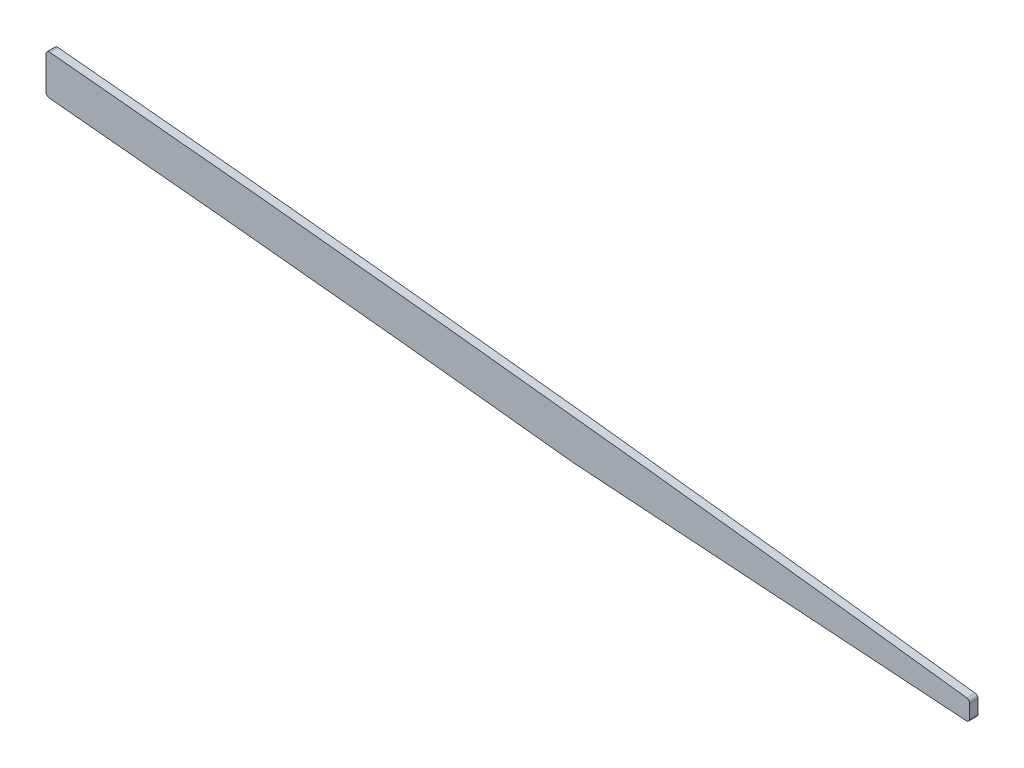
ISO-10303-21;
HEADER;
FILE_DESCRIPTION(('STEP AP214'),'2;1');
FILE_NAME('part.step','',(''),(''),'','','');
FILE_SCHEMA(('AUTOMOTIVE_DESIGN { 1 0 10303 214 1 1 1 1 }'));
ENDSEC;
DATA;
#1=APPLICATION_CONTEXT('core data for automotive mechanical design processes');
#2=APPLICATION_PROTOCOL_DEFINITION('international standard','automotive_design',2000,#1);
#3=PRODUCT_CONTEXT('',#1,'mechanical');
#4=PRODUCT('Part','Part','',(#3));
#5=PRODUCT_RELATED_PRODUCT_CATEGORY('part','',(#4));
#6=PRODUCT_DEFINITION_FORMATION('','',#4);
#7=PRODUCT_DEFINITION_CONTEXT('part definition',#1,'design');
#8=PRODUCT_DEFINITION('design','',#6,#7);
#9=PRODUCT_DEFINITION_SHAPE('','',#8);
#10=(LENGTH_UNIT() NAMED_UNIT(*) SI_UNIT(.MILLI.,.METRE.));
#11=(NAMED_UNIT(*) PLANE_ANGLE_UNIT() SI_UNIT($,.RADIAN.));
#12=(NAMED_UNIT(*) SI_UNIT($,.STERADIAN.) SOLID_ANGLE_UNIT());
#13=UNCERTAINTY_MEASURE_WITH_UNIT(LENGTH_MEASURE(1.E-05),#10,'distance_accuracy_value','');
#14=(GEOMETRIC_REPRESENTATION_CONTEXT(3) GLOBAL_UNCERTAINTY_ASSIGNED_CONTEXT((#13)) GLOBAL_UNIT_ASSIGNED_CONTEXT((#10,
#11,#12)) REPRESENTATION_CONTEXT('',''));
#15=CARTESIAN_POINT('',(0.,0.,0.));
#16=DIRECTION('',(0.,0.,1.));
#17=DIRECTION('',(1.,0.,0.));
#18=AXIS2_PLACEMENT_3D('',#15,#16,#17);
#19=CARTESIAN_POINT('',(2311.4,-7.40544774906732E-11,1.5875));
#20=DIRECTION('',(1.,0.,0.));
#21=DIRECTION('',(0.,1.,0.));
#22=AXIS2_PLACEMENT_3D('',#19,#20,#21);
#23=PLANE('',#22);
#24=DIRECTION('',(0.,-1.,0.));
#25=VECTOR('',#24,1.);
#26=CARTESIAN_POINT('',(2311.4,-7.40544774906732E-11,-1.5875));
#27=LINE('',#26,#25);
#28=CARTESIAN_POINT('',(2311.4,134.435488249285,-1.5875));
#29=VERTEX_POINT('',#28);
#30=CARTESIAN_POINT('',(2311.4,121.679854212148,-1.5875));
#31=VERTEX_POINT('',#30);
#32=EDGE_CURVE('E177',#29,#31,#27,.T.);
#33=ORIENTED_EDGE('',*,*,#32,.T.);
#34=DIRECTION('',(0.,0.,-1.));
#35=VECTOR('',#34,1.);
#36=CARTESIAN_POINT('',(2311.4,121.679854212148,1.5875));
#37=LINE('',#36,#35);
#38=CARTESIAN_POINT('',(2311.4,121.679854212148,1.5875));
#39=VERTEX_POINT('',#38);
#40=EDGE_CURVE('E224',#31,#39,#37,.F.);
#41=ORIENTED_EDGE('',*,*,#40,.T.);
#42=DIRECTION('',(0.,-1.,0.));
#43=VECTOR('',#42,1.);
#44=CARTESIAN_POINT('',(2311.4,-7.40544774906732E-11,1.5875));
#45=LINE('',#44,#43);
#46=CARTESIAN_POINT('',(2311.4,134.435488249285,1.5875));
#47=VERTEX_POINT('',#46);
#48=EDGE_CURVE('E129',#47,#39,#45,.T.);
#49=ORIENTED_EDGE('',*,*,#48,.F.);
#50=DIRECTION('',(0.,0.,1.));
#51=VECTOR('',#50,1.);
#52=CARTESIAN_POINT('',(2311.4,134.435488249285,-1.5875));
#53=LINE('',#52,#51);
#54=EDGE_CURVE('E214',#47,#29,#53,.F.);
#55=ORIENTED_EDGE('',*,*,#54,.T.);
#56=EDGE_LOOP('',(#33,#41,#49,#55));
#57=FACE_BOUND('',#56,.T.);
#58=ADVANCED_FACE('F38',(#57),#23,.F.);
#59=CARTESIAN_POINT('',(816.035490090419,249.602504502473,1.5875));
#60=CARTESIAN_POINT('',(820.895958915978,248.948752998504,1.5875));
#61=CARTESIAN_POINT('',(830.611237516535,247.699685180795,1.5875));
#62=CARTESIAN_POINT('',(845.281067269815,245.953419482549,1.5875));
#63=CARTESIAN_POINT('',(860.086531547022,244.295598067093,1.5875));
#64=CARTESIAN_POINT('',(879.83070343434,242.186646027517,1.5875));
#65=CARTESIAN_POINT('',(904.36996709185,239.698279805688,1.5875));
#66=CARTESIAN_POINT('',(933.571022669327,236.832150625483,1.5875));
#67=CARTESIAN_POINT('',(962.642718040815,234.023667740898,1.5875));
#68=CARTESIAN_POINT('',(991.762593942944,231.241975908087,1.5875));
#69=CARTESIAN_POINT('',(1021.07201031471,228.475862291185,1.5875));
#70=CARTESIAN_POINT('',(1060.37643731472,224.796956681051,1.5875));
#71=CARTESIAN_POINT('',(1109.51301557685,220.18437886172,1.5875));
#72=CARTESIAN_POINT('',(1168.51119036116,214.817071985159,1.5875));
#73=CARTESIAN_POINT('',(1227.50012979269,209.662054041939,1.5875));
#74=CARTESIAN_POINT('',(1306.13316794657,203.021178328389,1.5875));
#75=CARTESIAN_POINT('',(1404.36147710547,194.920725932278,1.5875));
#76=CARTESIAN_POINT('',(1522.23985107062,184.918066624094,1.5875));
#77=CARTESIAN_POINT('',(1640.18285649102,175.16700778633,1.5875));
#78=CARTESIAN_POINT('',(1758.16535256682,165.7576394845,1.5875));
#79=CARTESIAN_POINT('',(1876.15538476943,156.590937078959,1.5875));
#80=CARTESIAN_POINT('',(1994.08749188002,147.453250142139,1.5875));
#81=CARTESIAN_POINT('',(2092.26869206097,139.624216053351,1.5875));
#82=CARTESIAN_POINT('',(2170.74802904205,133.07965672904,1.5875));
#83=CARTESIAN_POINT('',(2219.77173097685,128.842227835716,1.5875));
#84=CARTESIAN_POINT('',(2258.98398824696,125.347211495477,1.5875));
#85=CARTESIAN_POINT('',(2288.37945753647,122.670854497073,1.5875));
#86=CARTESIAN_POINT('',(2317.81224311603,119.931729386451,1.5875));
#87=CARTESIAN_POINT('',(2347.55150917161,117.100365282643,1.5875));
#88=CARTESIAN_POINT('',(2377.15989972739,114.210118529692,1.5875));
#89=CARTESIAN_POINT('',(2406.46965385077,111.268968010355,1.5875));
#90=CARTESIAN_POINT('',(2435.81832605954,108.240091266207,1.5875));
#91=CARTESIAN_POINT('',(2469.02470752222,104.715289084564,1.5875));
#92=CARTESIAN_POINT('',(2497.31327256554,101.612328458115,1.5875));
#93=CARTESIAN_POINT('',(2518.24528997175,99.2591125176473,1.5875));
#94=CARTESIAN_POINT('',(2543.59485523623,96.3823723988054,1.5875));
#95=CARTESIAN_POINT('',(2583.46809293913,91.7389200548886,1.5875));
#96=CARTESIAN_POINT('',(2626.50474404992,86.507235465956,1.5875));
#97=CARTESIAN_POINT('',(2656.9573225255,82.7046844863666,1.5875));
#98=CARTESIAN_POINT('',(2676.22814845177,80.2695409508187,1.5875));
#99=CARTESIAN_POINT('',(2689.72957405404,78.5388507758172,1.5875));
#100=CARTESIAN_POINT('',(2697.83785996013,77.4903351724698,1.5875));
#101=B_SPLINE_CURVE_WITH_KNOTS('',3,(#59,#60,#61,#62,#63,#64,#65,#66,#67,#68,#69,#70,#71,#72,
#73,#74,#75,#76,#77,#78,#79,#80,#81,#82,#83,#84,#85,#86,#87,#88,#89,#90,#91,#92,#93,#94,#95,#96,
#97,#98,#99,#100),.UNSPECIFIED.,.F.,.F.,(4,1,1,1,1,1,1,1,1,1,1,1,1,1,1,1,1,1,1,1,1,1,1,1,1,1,1,
1,1,1,1,1,1,1,1,1,1,1,1,4),(77.9308215150932,79.3861761032565,80.8415306914199,82.2968852795832,
83.7522398677466,86.6629490440732,89.5736582203999,92.4843673967266,95.3950765730532,
98.3057857493799,101.216494925707,107.03791327836,112.859331631013,118.680749983667,
124.50216833632,136.145005041627,147.787841746933,159.43067845224,171.073515157547,
182.716351862853,194.35918856816,206.002025273467,211.82344362612,217.644861978773,
220.5555711551,223.466280331427,226.376989507753,229.28769868408,232.198407860407,
235.109117036733,238.01982621306,240.930535389387,244.99811874271,246.453473330873,
247.181150624955,252.573372094693,258.394790447347,260.132380463724,261.765911798234,
264.2162088),.UNSPECIFIED.);
#102=DIRECTION('',(0.,0.,-1.));
#103=VECTOR('',#102,1.);
#104=SURFACE_OF_LINEAR_EXTRUSION('',#101,#103);
#105=CARTESIAN_POINT('',(2312.55144834193,120.415399584901,1.5875));
#106=VERTEX_POINT('',#105);
#107=CARTESIAN_POINT('',(2513.37105245866,99.8062133455946,1.5875));
#108=VERTEX_POINT('',#107);
#109=EDGE_CURVE('E119',#106,#108,#101,.T.);
#110=ORIENTED_EDGE('',*,*,#109,.F.);
#111=DIRECTION('',(0.,0.,-1.));
#112=VECTOR('',#111,1.);
#113=CARTESIAN_POINT('',(2312.55144834193,120.415399584901,1.5875));
#114=LINE('',#113,#112);
#115=CARTESIAN_POINT('',(2312.55144834193,120.415399584901,-1.5875));
#116=VERTEX_POINT('',#115);
#117=EDGE_CURVE('E135',#106,#116,#114,.T.);
#118=ORIENTED_EDGE('',*,*,#117,.T.);
#119=CARTESIAN_POINT('',(816.035490090419,249.602504502473,-1.5875));
#120=CARTESIAN_POINT('',(820.895958915978,248.948752998504,-1.5875));
#121=CARTESIAN_POINT('',(830.611237516535,247.699685180795,-1.5875));
#122=CARTESIAN_POINT('',(845.281067269815,245.953419482549,-1.5875));
#123=CARTESIAN_POINT('',(860.086531547022,244.295598067093,-1.5875));
#124=CARTESIAN_POINT('',(879.83070343434,242.186646027517,-1.5875));
#125=CARTESIAN_POINT('',(904.36996709185,239.698279805688,-1.5875));
#126=CARTESIAN_POINT('',(933.571022669327,236.832150625483,-1.5875));
#127=CARTESIAN_POINT('',(962.642718040815,234.023667740898,-1.5875));
#128=CARTESIAN_POINT('',(991.762593942944,231.241975908087,-1.5875));
#129=CARTESIAN_POINT('',(1021.07201031471,228.475862291185,-1.5875));
#130=CARTESIAN_POINT('',(1060.37643731472,224.796956681051,-1.5875));
#131=CARTESIAN_POINT('',(1109.51301557685,220.18437886172,-1.5875));
#132=CARTESIAN_POINT('',(1168.51119036116,214.817071985159,-1.5875));
#133=CARTESIAN_POINT('',(1227.50012979269,209.662054041939,-1.5875));
#134=CARTESIAN_POINT('',(1306.13316794657,203.021178328389,-1.5875));
#135=CARTESIAN_POINT('',(1404.36147710547,194.920725932278,-1.5875));
#136=CARTESIAN_POINT('',(1522.23985107062,184.918066624094,-1.5875));
#137=CARTESIAN_POINT('',(1640.18285649102,175.16700778633,-1.5875));
#138=CARTESIAN_POINT('',(1758.16535256682,165.7576394845,-1.5875));
#139=CARTESIAN_POINT('',(1876.15538476943,156.590937078959,-1.5875));
#140=CARTESIAN_POINT('',(1994.08749188002,147.453250142139,-1.5875));
#141=CARTESIAN_POINT('',(2092.26869206097,139.624216053351,-1.5875));
#142=CARTESIAN_POINT('',(2170.74802904205,133.07965672904,-1.5875));
#143=CARTESIAN_POINT('',(2219.77173097685,128.842227835716,-1.5875));
#144=CARTESIAN_POINT('',(2258.98398824696,125.347211495477,-1.5875));
#145=CARTESIAN_POINT('',(2288.37945753647,122.670854497073,-1.5875));
#146=CARTESIAN_POINT('',(2317.81224311603,119.931729386451,-1.5875));
#147=CARTESIAN_POINT('',(2347.55150917161,117.100365282643,-1.5875));
#148=CARTESIAN_POINT('',(2377.15989972739,114.210118529692,-1.5875));
#149=CARTESIAN_POINT('',(2406.46965385077,111.268968010355,-1.5875));
#150=CARTESIAN_POINT('',(2435.81832605954,108.240091266207,-1.5875));
#151=CARTESIAN_POINT('',(2469.02470752222,104.715289084564,-1.5875));
#152=CARTESIAN_POINT('',(2497.31327256554,101.612328458115,-1.5875));
#153=CARTESIAN_POINT('',(2518.24528997175,99.2591125176473,-1.5875));
#154=CARTESIAN_POINT('',(2543.59485523623,96.3823723988054,-1.5875));
#155=CARTESIAN_POINT('',(2583.46809293913,91.7389200548886,-1.5875));
#156=CARTESIAN_POINT('',(2626.50474404992,86.507235465956,-1.5875));
#157=CARTESIAN_POINT('',(2656.9573225255,82.7046844863666,-1.5875));
#158=CARTESIAN_POINT('',(2676.22814845177,80.2695409508187,-1.5875));
#159=CARTESIAN_POINT('',(2689.72957405404,78.5388507758172,-1.5875));
#160=CARTESIAN_POINT('',(2697.83785996013,77.4903351724698,-1.5875));
#161=B_SPLINE_CURVE_WITH_KNOTS('',3,(#119,#120,#121,#122,#123,#124,#125,#126,#127,#128,#129,
#130,#131,#132,#133,#134,#135,#136,#137,#138,#139,#140,#141,#142,#143,#144,#145,#146,#147,#148,
#149,#150,#151,#152,#153,#154,#155,#156,#157,#158,#159,#160),.UNSPECIFIED.,.F.,.F.,(4,1,1,1,1,1,
1,1,1,1,1,1,1,1,1,1,1,1,1,1,1,1,1,1,1,1,1,1,1,1,1,1,1,1,1,1,1,1,1,4),(77.9308215150932,
79.3861761032565,80.8415306914199,82.2968852795832,83.7522398677466,86.6629490440732,
89.5736582203999,92.4843673967266,95.3950765730532,98.3057857493799,101.216494925707,
107.03791327836,112.859331631013,118.680749983667,124.50216833632,136.145005041627,
147.787841746933,159.43067845224,171.073515157547,182.716351862853,194.35918856816,
206.002025273467,211.82344362612,217.644861978773,220.5555711551,223.466280331427,
226.376989507753,229.28769868408,232.198407860407,235.109117036733,238.01982621306,
240.930535389387,244.99811874271,246.453473330873,247.181150624955,252.573372094693,
258.394790447347,260.132380463724,261.765911798234,264.2162088),.UNSPECIFIED.);
#162=CARTESIAN_POINT('',(2513.37105245866,99.8062133455946,-1.5875));
#163=VERTEX_POINT('',#162);
#164=EDGE_CURVE('E134',#116,#163,#161,.T.);
#165=ORIENTED_EDGE('',*,*,#164,.T.);
#166=DIRECTION('',(0.,0.,-1.));
#167=VECTOR('',#166,1.);
#168=CARTESIAN_POINT('',(2513.37105245866,99.8062133455946,1.5875));
#169=LINE('',#168,#167);
#170=EDGE_CURVE('E115',#108,#163,#169,.T.);
#171=ORIENTED_EDGE('',*,*,#170,.F.);
#172=EDGE_LOOP('',(#110,#118,#165,#171));
#173=FACE_BOUND('',#172,.T.);
#174=ADVANCED_FACE('F132',(#173),#104,.F.);
#175=CARTESIAN_POINT('',(18.6387186444079,271.237546195136,1.5875));
#176=DIRECTION('',(-0.0685556534196936,-0.997647293578346,0.));
#177=DIRECTION('',(0.997647293578346,-0.0685556534196936,0.));
#178=AXIS2_PLACEMENT_3D('',#175,#176,#177);
#179=PLANE('',#178);
#180=DIRECTION('',(-0.997647293578346,0.0685556534196936,0.));
#181=VECTOR('',#180,1.);
#182=CARTESIAN_POINT('',(18.6387186444079,271.237546195136,-1.5875));
#183=LINE('',#182,#181);
#184=CARTESIAN_POINT('',(2664.05543432016,89.451585687953,-1.5875));
#185=VERTEX_POINT('',#184);
#186=EDGE_CURVE('E142',#185,#163,#183,.T.);
#187=ORIENTED_EDGE('',*,*,#186,.F.);
#188=DIRECTION('',(0.,0.,-1.));
#189=VECTOR('',#188,1.);
#190=CARTESIAN_POINT('',(2664.05543432016,89.4515856879531,1.5875));
#191=LINE('',#190,#189);
#192=CARTESIAN_POINT('',(2664.05543432016,89.451585687953,1.5875));
#193=VERTEX_POINT('',#192);
#194=EDGE_CURVE('E11',#185,#193,#191,.F.);
#195=ORIENTED_EDGE('',*,*,#194,.T.);
#196=DIRECTION('',(-0.997647293578346,0.0685556534196936,0.));
#197=VECTOR('',#196,1.);
#198=CARTESIAN_POINT('',(18.6387186444079,271.237546195136,1.5875));
#199=LINE('',#198,#197);
#200=EDGE_CURVE('E110',#193,#108,#199,.T.);
#201=ORIENTED_EDGE('',*,*,#200,.T.);
#202=ORIENTED_EDGE('',*,*,#170,.T.);
#203=EDGE_LOOP('',(#187,#195,#201,#202));
#204=FACE_BOUND('',#203,.T.);
#205=ADVANCED_FACE('F113',(#204),#179,.T.);
#206=CARTESIAN_POINT('',(2665.41250000001,1.54114769880156E-10,1.5875));
#207=DIRECTION('',(1.,0.,0.));
#208=DIRECTION('',(0.,1.,0.));
#209=AXIS2_PLACEMENT_3D('',#206,#207,#208);
#210=PLANE('',#209);
#211=DIRECTION('',(0.,-1.,0.));
#212=VECTOR('',#211,1.);
#213=CARTESIAN_POINT('',(2665.41250000001,1.54114769880156E-10,-1.5875));
#214=LINE('',#213,#212);
#215=CARTESIAN_POINT('',(2665.4125,95.8764407852826,-1.5875));
#216=VERTEX_POINT('',#215);
#217=CARTESIAN_POINT('',(2665.4125,90.7185977507976,-1.5875));
#218=VERTEX_POINT('',#217);
#219=EDGE_CURVE('E181',#216,#218,#214,.T.);
#220=ORIENTED_EDGE('',*,*,#219,.F.);
#221=DIRECTION('',(0.,0.,-1.));
#222=VECTOR('',#221,1.);
#223=CARTESIAN_POINT('',(2665.4125,95.8764407852826,1.5875));
#224=LINE('',#223,#222);
#225=CARTESIAN_POINT('',(2665.4125,95.8764407852826,1.5875));
#226=VERTEX_POINT('',#225);
#227=EDGE_CURVE('E46',#216,#226,#224,.F.);
#228=ORIENTED_EDGE('',*,*,#227,.T.);
#229=DIRECTION('',(0.,-1.,0.));
#230=VECTOR('',#229,1.);
#231=CARTESIAN_POINT('',(2665.41250000001,1.54114769880156E-10,1.5875));
#232=LINE('',#231,#230);
#233=CARTESIAN_POINT('',(2665.4125,90.7185977507976,1.5875));
#234=VERTEX_POINT('',#233);
#235=EDGE_CURVE('E118',#226,#234,#232,.T.);
#236=ORIENTED_EDGE('',*,*,#235,.T.);
#237=DIRECTION('',(0.,0.,-1.));
#238=VECTOR('',#237,1.);
#239=CARTESIAN_POINT('',(2665.4125,90.7185977507976,1.5875));
#240=LINE('',#239,#238);
#241=EDGE_CURVE('E245',#234,#218,#240,.T.);
#242=ORIENTED_EDGE('',*,*,#241,.T.);
#243=EDGE_LOOP('',(#220,#228,#236,#242));
#244=FACE_BOUND('',#243,.T.);
#245=ADVANCED_FACE('F164',(#244),#210,.T.);
#246=CARTESIAN_POINT('',(818.067033698442,264.706491743222,1.5875));
#247=CARTESIAN_POINT('',(827.043059883077,263.499182154688,1.5875));
#248=CARTESIAN_POINT('',(836.029088262746,262.37336018535,1.5875));
#249=CARTESIAN_POINT('',(845.086758911477,261.305822737124,1.5875));
#250=CARTESIAN_POINT('',(891.386485356828,256.087047064925,1.5875));
#251=CARTESIAN_POINT('',(937.686211733138,251.779150949417,1.5875));
#252=CARTESIAN_POINT('',(973.452075064018,248.227669424888,1.5875));
#253=CARTESIAN_POINT('',(1071.94667214103,239.051054037575,1.5875));
#254=CARTESIAN_POINT('',(1170.4412693194,229.731506737662,1.5875));
#255=CARTESIAN_POINT('',(1231.79194034372,224.503945812963,1.5875));
#256=CARTESIAN_POINT('',(1324.89933614602,216.790627817024,1.5875));
#257=CARTESIAN_POINT('',(1418.00673093479,209.040117977579,1.5875));
#258=CARTESIAN_POINT('',(1449.7429359212,206.361809936344,1.5875));
#259=CARTESIAN_POINT('',(1636.92860677809,190.521130341518,1.5875));
#260=CARTESIAN_POINT('',(1824.11427763497,175.409157235081,1.5875));
#261=CARTESIAN_POINT('',(1979.96694737597,164.299650252625,1.5875));
#262=CARTESIAN_POINT('',(2156.26863942885,150.414433314205,1.5875));
#263=CARTESIAN_POINT('',(2332.5703304682,133.85721640186,1.5875));
#264=CARTESIAN_POINT('',(2354.21298315715,131.785082220072,1.5875));
#265=CARTESIAN_POINT('',(2436.3555443117,123.723952135345,1.5875));
#266=CARTESIAN_POINT('',(2518.49810546626,114.859112916573,1.5875));
#267=CARTESIAN_POINT('',(2579.48130742255,107.74251493933,1.5875));
#268=CARTESIAN_POINT('',(2639.63682069028,100.383443901382,1.5875));
#269=CARTESIAN_POINT('',(2699.79233294449,92.6044886503654,1.5875));
#270=(BOUNDED_CURVE() B_SPLINE_CURVE(5,(#246,#247,#248,#249,#250,#251,#252,#253,#254,#255,#256,
#257,#258,#259,#260,#261,#262,#263,#264,#265,#266,#267,#268,#269),.UNSPECIFIED.,.F.,
.F.) B_SPLINE_CURVE_WITH_KNOTS((6,3,3,3,3,3,3,6),(77.9308215150932,82.46579272,100.7932901,
131.0989539,146.7691983,223.5339586,233.9431167,264.2162088),
.UNSPECIFIED.) CURVE() GEOMETRIC_REPRESENTATION_ITEM() RATIONAL_B_SPLINE_CURVE((1.,1.,1.,1.,1.,
1.,1.,1.,1.,1.,1.,1.,1.,1.,1.,1.,1.,1.,1.,1.,1.,1.,1.,1.)) REPRESENTATION_ITEM(''));
#271=DIRECTION('',(0.,0.,-1.));
#272=VECTOR('',#271,1.);
#273=SURFACE_OF_LINEAR_EXTRUSION('',#270,#272);
#274=CARTESIAN_POINT('',(2664.30138258873,97.1364631354804,-1.5875));
#275=CARTESIAN_POINT('',(2611.18909164487,103.833660432831,-1.5875));
#276=CARTESIAN_POINT('',(2557.89544916821,110.239289178493,-1.5875));
#277=CARTESIAN_POINT('',(2504.07783710443,116.409158480157,-1.5875));
#278=CARTESIAN_POINT('',(2433.59454121578,123.955194832583,-1.5875));
#279=CARTESIAN_POINT('',(2363.11124532712,130.909485863991,-1.5875));
#280=CARTESIAN_POINT('',(2346.23667710793,132.541975503277,-1.5875));
#281=CARTESIAN_POINT('',(2329.46067334562,134.138263582643,-1.5875));
#282=CARTESIAN_POINT('',(2312.78844254862,135.699953101574,-1.5875));
#283=(BOUNDED_CURVE() B_SPLINE_CURVE(5,(#274,#275,#276,#277,#278,#279,#280,#281,#282),
.UNSPECIFIED.,.F.,.F.) B_SPLINE_CURVE_WITH_KNOTS((6,3,6),(225.737452883937,252.439625370516,
260.645289186579),
.UNSPECIFIED.) CURVE() GEOMETRIC_REPRESENTATION_ITEM() RATIONAL_B_SPLINE_CURVE((1.,1.,1.,1.,1.,
1.,1.,1.,1.)) REPRESENTATION_ITEM(''));
#284=CARTESIAN_POINT('',(2312.78844256647,135.699953292056,-1.5875));
#285=VERTEX_POINT('',#284);
#286=CARTESIAN_POINT('',(2664.30138268303,97.1364638833327,-1.5875));
#287=VERTEX_POINT('',#286);
#288=EDGE_CURVE('E202',#285,#287,#283,.F.);
#289=ORIENTED_EDGE('',*,*,#288,.F.);
#290=DIRECTION('',(0.,0.,-1.));
#291=VECTOR('',#290,1.);
#292=CARTESIAN_POINT('',(2312.78844254863,135.699953101574,-1.5875));
#293=LINE('',#292,#291);
#294=CARTESIAN_POINT('',(2312.78844256657,135.699953293182,1.5875));
#295=VERTEX_POINT('',#294);
#296=EDGE_CURVE('E60',#285,#295,#293,.F.);
#297=ORIENTED_EDGE('',*,*,#296,.T.);
#298=CARTESIAN_POINT('',(2312.78844254863,135.699953101574,1.5875));
#299=CARTESIAN_POINT('',(2329.46067334562,134.138263582643,1.5875));
#300=CARTESIAN_POINT('',(2346.23667710793,132.541975503277,1.5875));
#301=CARTESIAN_POINT('',(2363.11124532712,130.909485863991,1.5875));
#302=CARTESIAN_POINT('',(2433.59454121578,123.955194832583,1.5875));
#303=CARTESIAN_POINT('',(2504.07783710443,116.409158480157,1.5875));
#304=CARTESIAN_POINT('',(2557.89544916821,110.239289178493,1.5875));
#305=CARTESIAN_POINT('',(2611.18909164487,103.833660432831,1.5875));
#306=CARTESIAN_POINT('',(2664.30138258873,97.1364631354806,1.5875));
#307=(BOUNDED_CURVE() B_SPLINE_CURVE(5,(#298,#299,#300,#301,#302,#303,#304,#305,#306),
.UNSPECIFIED.,.F.,.F.) B_SPLINE_CURVE_WITH_KNOTS((6,3,6),(225.737452883937,233.9431167,
260.645289186579),
.UNSPECIFIED.) CURVE() GEOMETRIC_REPRESENTATION_ITEM() RATIONAL_B_SPLINE_CURVE((1.,1.,1.,1.,1.,
1.,1.,1.,1.)) REPRESENTATION_ITEM(''));
#308=CARTESIAN_POINT('',(2664.30138268297,97.1364638828841,1.5875));
#309=VERTEX_POINT('',#308);
#310=EDGE_CURVE('E136',#295,#309,#307,.T.);
#311=ORIENTED_EDGE('',*,*,#310,.T.);
#312=DIRECTION('',(0.,0.,-1.));
#313=VECTOR('',#312,1.);
#314=CARTESIAN_POINT('',(2664.30138258872,97.1364631354811,1.5875));
#315=LINE('',#314,#313);
#316=EDGE_CURVE('E240',#309,#287,#315,.T.);
#317=ORIENTED_EDGE('',*,*,#316,.T.);
#318=EDGE_LOOP('',(#289,#297,#311,#317));
#319=FACE_BOUND('',#318,.T.);
#320=ADVANCED_FACE('F153',(#319),#273,.T.);
#321=CARTESIAN_POINT('',(0.,0.,1.5875));
#322=DIRECTION('',(0.,0.,1.));
#323=DIRECTION('',(1.,0.,0.));
#324=AXIS2_PLACEMENT_3D('',#321,#322,#323);
#325=PLANE('',#324);
#326=ORIENTED_EDGE('',*,*,#48,.T.);
#327=CARTESIAN_POINT('',(2312.67,121.679854212148,1.5875));
#328=DIRECTION('',(0.,0.,1.));
#329=DIRECTION('',(1.,0.,0.));
#330=AXIS2_PLACEMENT_3D('',#327,#328,#329);
#331=CIRCLE('',#330,1.27);
#332=EDGE_CURVE('E125',#39,#106,#331,.T.);
#333=ORIENTED_EDGE('',*,*,#332,.T.);
#334=ORIENTED_EDGE('',*,*,#109,.T.);
#335=ORIENTED_EDGE('',*,*,#200,.F.);
#336=CARTESIAN_POINT('',(2664.1425,90.7185977507976,1.5875));
#337=DIRECTION('',(0.,0.,1.));
#338=DIRECTION('',(1.,0.,0.));
#339=AXIS2_PLACEMENT_3D('',#336,#337,#338);
#340=CIRCLE('',#339,1.27);
#341=EDGE_CURVE('E230',#193,#234,#340,.T.);
#342=ORIENTED_EDGE('',*,*,#341,.T.);
#343=ORIENTED_EDGE('',*,*,#235,.F.);
#344=CARTESIAN_POINT('',(2664.1425,95.8764407852825,1.5875));
#345=DIRECTION('',(0.,0.,1.));
#346=DIRECTION('',(1.,0.,0.));
#347=AXIS2_PLACEMENT_3D('',#344,#345,#346);
#348=CIRCLE('',#347,1.27);
#349=EDGE_CURVE('E53',#226,#309,#348,.T.);
#350=ORIENTED_EDGE('',*,*,#349,.T.);
#351=ORIENTED_EDGE('',*,*,#310,.F.);
#352=CARTESIAN_POINT('',(2312.67,134.435488249285,1.5875));
#353=DIRECTION('',(0.,0.,1.));
#354=DIRECTION('',(1.,0.,0.));
#355=AXIS2_PLACEMENT_3D('',#352,#353,#354);
#356=CIRCLE('',#355,1.27);
#357=EDGE_CURVE('E233',#295,#47,#356,.T.);
#358=ORIENTED_EDGE('',*,*,#357,.T.);
#359=EDGE_LOOP('',(#326,#333,#334,#335,#342,#343,#350,#351,#358));
#360=FACE_BOUND('',#359,.T.);
#361=ADVANCED_FACE('F123',(#360),#325,.T.);
#362=CARTESIAN_POINT('',(0.,0.,-1.5875));
#363=DIRECTION('',(0.,0.,1.));
#364=DIRECTION('',(1.,0.,0.));
#365=AXIS2_PLACEMENT_3D('',#362,#363,#364);
#366=PLANE('',#365);
#367=ORIENTED_EDGE('',*,*,#164,.F.);
#368=CARTESIAN_POINT('',(2312.67,121.679854212148,-1.5875));
#369=DIRECTION('',(0.,0.,1.));
#370=DIRECTION('',(1.,0.,0.));
#371=AXIS2_PLACEMENT_3D('',#368,#369,#370);
#372=CIRCLE('',#371,1.27);
#373=EDGE_CURVE('E210',#116,#31,#372,.F.);
#374=ORIENTED_EDGE('',*,*,#373,.T.);
#375=ORIENTED_EDGE('',*,*,#32,.F.);
#376=CARTESIAN_POINT('',(2312.67,134.435488249285,-1.5875));
#377=DIRECTION('',(0.,0.,1.));
#378=DIRECTION('',(1.,0.,0.));
#379=AXIS2_PLACEMENT_3D('',#376,#377,#378);
#380=CIRCLE('',#379,1.27);
#381=EDGE_CURVE('E206',#29,#285,#380,.F.);
#382=ORIENTED_EDGE('',*,*,#381,.T.);
#383=ORIENTED_EDGE('',*,*,#288,.T.);
#384=CARTESIAN_POINT('',(2664.1425,95.8764407852825,-1.5875));
#385=DIRECTION('',(0.,0.,1.));
#386=DIRECTION('',(1.,0.,0.));
#387=AXIS2_PLACEMENT_3D('',#384,#385,#386);
#388=CIRCLE('',#387,1.27);
#389=EDGE_CURVE('E204',#287,#216,#388,.F.);
#390=ORIENTED_EDGE('',*,*,#389,.T.);
#391=ORIENTED_EDGE('',*,*,#219,.T.);
#392=CARTESIAN_POINT('',(2664.1425,90.7185977507976,-1.5875));
#393=DIRECTION('',(0.,0.,1.));
#394=DIRECTION('',(1.,0.,0.));
#395=AXIS2_PLACEMENT_3D('',#392,#393,#394);
#396=CIRCLE('',#395,1.27);
#397=EDGE_CURVE('E138',#218,#185,#396,.F.);
#398=ORIENTED_EDGE('',*,*,#397,.T.);
#399=ORIENTED_EDGE('',*,*,#186,.T.);
#400=EDGE_LOOP('',(#367,#374,#375,#382,#383,#390,#391,#398,#399));
#401=FACE_BOUND('',#400,.T.);
#402=ADVANCED_FACE('F165',(#401),#366,.F.);
#403=CARTESIAN_POINT('',(2312.67,121.679854212148,0.));
#404=DIRECTION('',(0.,0.,-1.));
#405=DIRECTION('',(-1.,0.,0.));
#406=AXIS2_PLACEMENT_3D('',#403,#404,#405);
#407=CYLINDRICAL_SURFACE('',#406,1.27);
#408=ORIENTED_EDGE('',*,*,#332,.F.);
#409=ORIENTED_EDGE('',*,*,#40,.F.);
#410=ORIENTED_EDGE('',*,*,#373,.F.);
#411=ORIENTED_EDGE('',*,*,#117,.F.);
#412=EDGE_LOOP('',(#408,#409,#410,#411));
#413=FACE_BOUND('',#412,.T.);
#414=ADVANCED_FACE('F261',(#413),#407,.T.);
#415=CARTESIAN_POINT('',(2312.67,134.435488249285,0.));
#416=DIRECTION('',(0.,0.,-1.));
#417=DIRECTION('',(-1.,0.,0.));
#418=AXIS2_PLACEMENT_3D('',#415,#416,#417);
#419=CYLINDRICAL_SURFACE('',#418,1.27);
#420=ORIENTED_EDGE('',*,*,#357,.F.);
#421=ORIENTED_EDGE('',*,*,#296,.F.);
#422=ORIENTED_EDGE('',*,*,#381,.F.);
#423=ORIENTED_EDGE('',*,*,#54,.F.);
#424=EDGE_LOOP('',(#420,#421,#422,#423));
#425=FACE_BOUND('',#424,.T.);
#426=ADVANCED_FACE('F258',(#425),#419,.T.);
#427=CARTESIAN_POINT('',(2664.1425,95.8764407852825,0.));
#428=DIRECTION('',(0.,0.,-1.));
#429=DIRECTION('',(-1.,0.,0.));
#430=AXIS2_PLACEMENT_3D('',#427,#428,#429);
#431=CYLINDRICAL_SURFACE('',#430,1.27);
#432=ORIENTED_EDGE('',*,*,#349,.F.);
#433=ORIENTED_EDGE('',*,*,#227,.F.);
#434=ORIENTED_EDGE('',*,*,#389,.F.);
#435=ORIENTED_EDGE('',*,*,#316,.F.);
#436=EDGE_LOOP('',(#432,#433,#434,#435));
#437=FACE_BOUND('',#436,.T.);
#438=ADVANCED_FACE('F254',(#437),#431,.T.);
#439=CARTESIAN_POINT('',(2664.1425,90.7185977507976,1.5875));
#440=DIRECTION('',(0.,0.,-1.));
#441=DIRECTION('',(-1.,0.,0.));
#442=AXIS2_PLACEMENT_3D('',#439,#440,#441);
#443=CYLINDRICAL_SURFACE('',#442,1.27);
#444=ORIENTED_EDGE('',*,*,#341,.F.);
#445=ORIENTED_EDGE('',*,*,#194,.F.);
#446=ORIENTED_EDGE('',*,*,#397,.F.);
#447=ORIENTED_EDGE('',*,*,#241,.F.);
#448=EDGE_LOOP('',(#444,#445,#446,#447));
#449=FACE_BOUND('',#448,.T.);
#450=ADVANCED_FACE('F40',(#449),#443,.T.);
#451=CLOSED_SHELL('',(#58,#174,#205,#245,#320,#361,#402,#414,#426,#438,#450));
#452=MANIFOLD_SOLID_BREP('B2',#451);
#453=ADVANCED_BREP_SHAPE_REPRESENTATION('',(#18,#452),#14);
#454=SHAPE_DEFINITION_REPRESENTATION(#9,#453);
ENDSEC;
END-ISO-10303-21;
